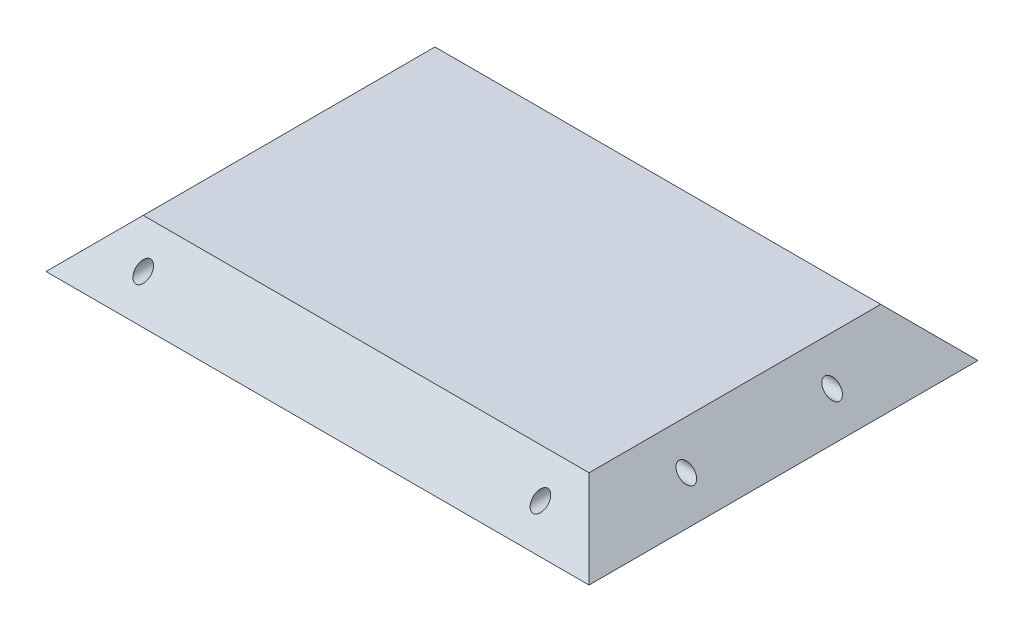
ISO-10303-21;
HEADER;
FILE_DESCRIPTION(('STEP AP214'),'2;1');
FILE_NAME('part.step','',(''),(''),'','','');
FILE_SCHEMA(('AUTOMOTIVE_DESIGN { 1 0 10303 214 1 1 1 1 }'));
ENDSEC;
DATA;
#1=APPLICATION_CONTEXT('core data for automotive mechanical design processes');
#2=APPLICATION_PROTOCOL_DEFINITION('international standard','automotive_design',2000,#1);
#3=PRODUCT_CONTEXT('',#1,'mechanical');
#4=PRODUCT('Part','Part','',(#3));
#5=PRODUCT_RELATED_PRODUCT_CATEGORY('part','',(#4));
#6=PRODUCT_DEFINITION_FORMATION('','',#4);
#7=PRODUCT_DEFINITION_CONTEXT('part definition',#1,'design');
#8=PRODUCT_DEFINITION('design','',#6,#7);
#9=PRODUCT_DEFINITION_SHAPE('','',#8);
#10=(LENGTH_UNIT() NAMED_UNIT(*) SI_UNIT(.MILLI.,.METRE.));
#11=(NAMED_UNIT(*) PLANE_ANGLE_UNIT() SI_UNIT($,.RADIAN.));
#12=(NAMED_UNIT(*) SI_UNIT($,.STERADIAN.) SOLID_ANGLE_UNIT());
#13=UNCERTAINTY_MEASURE_WITH_UNIT(LENGTH_MEASURE(1.E-05),#10,'distance_accuracy_value','');
#14=(GEOMETRIC_REPRESENTATION_CONTEXT(3) GLOBAL_UNCERTAINTY_ASSIGNED_CONTEXT((#13)) GLOBAL_UNIT_ASSIGNED_CONTEXT((#10,
#11,#12)) REPRESENTATION_CONTEXT('',''));
#15=CARTESIAN_POINT('',(0.,0.,0.));
#16=DIRECTION('',(0.,0.,1.));
#17=DIRECTION('',(1.,0.,0.));
#18=AXIS2_PLACEMENT_3D('',#15,#16,#17);
#19=CARTESIAN_POINT('',(-27.925,27.925,0.));
#20=DIRECTION('',(0.707106781186547,-0.707106781186547,0.));
#21=DIRECTION('',(0.707106781186548,0.707106781186547,0.));
#22=AXIS2_PLACEMENT_3D('',#19,#20,#21);
#23=PLANE('',#22);
#24=DIRECTION('',(0.577350269189626,0.577350269189626,-0.577350269189626));
#25=VECTOR('',#24,1.);
#26=CARTESIAN_POINT('',(-55.85,0.,40.));
#27=LINE('',#26,#25);
#28=CARTESIAN_POINT('',(-55.85,0.,40.));
#29=VERTEX_POINT('',#28);
#30=CARTESIAN_POINT('',(-45.85,10.,30.));
#31=VERTEX_POINT('',#30);
#32=EDGE_CURVE('E70',#29,#31,#27,.T.);
#33=ORIENTED_EDGE('',*,*,#32,.T.);
#34=DIRECTION('',(0.,0.,1.));
#35=VECTOR('',#34,1.);
#36=CARTESIAN_POINT('',(-45.85,10.,-30.));
#37=LINE('',#36,#35);
#38=CARTESIAN_POINT('',(-45.85,10.,-30.));
#39=VERTEX_POINT('',#38);
#40=EDGE_CURVE('E55',#39,#31,#37,.T.);
#41=ORIENTED_EDGE('',*,*,#40,.F.);
#42=DIRECTION('',(0.577350269189626,0.577350269189626,0.577350269189626));
#43=VECTOR('',#42,1.);
#44=CARTESIAN_POINT('',(-55.85,0.,-40.));
#45=LINE('',#44,#43);
#46=CARTESIAN_POINT('',(-55.85,0.,-40.));
#47=VERTEX_POINT('',#46);
#48=EDGE_CURVE('E110',#47,#39,#45,.T.);
#49=ORIENTED_EDGE('',*,*,#48,.F.);
#50=DIRECTION('',(0.,0.,1.));
#51=VECTOR('',#50,1.);
#52=CARTESIAN_POINT('',(-55.85,0.,40.));
#53=LINE('',#52,#51);
#54=EDGE_CURVE('E88',#47,#29,#53,.T.);
#55=ORIENTED_EDGE('',*,*,#54,.T.);
#56=EDGE_LOOP('',(#33,#41,#49,#55));
#57=FACE_BOUND('',#56,.T.);
#58=CARTESIAN_POINT('',(-50.85,5.,15.));
#59=DIRECTION('',(0.707106781186547,-0.707106781186547,0.));
#60=DIRECTION('',(-0.707106781186548,-0.707106781186547,0.));
#61=AXIS2_PLACEMENT_3D('',#58,#59,#60);
#62=ELLIPSE('',#61,2.12132034355964,1.5);
#63=CARTESIAN_POINT('',(-52.35,3.5,15.));
#64=VERTEX_POINT('',#63);
#65=EDGE_CURVE('E245',#64,#64,#62,.F.);
#66=ORIENTED_EDGE('',*,*,#65,.F.);
#67=EDGE_LOOP('',(#66));
#68=FACE_BOUND('',#67,.T.);
#69=CARTESIAN_POINT('',(-50.85,5.,-15.));
#70=DIRECTION('',(0.707106781186547,-0.707106781186547,0.));
#71=DIRECTION('',(-0.707106781186548,-0.707106781186547,0.));
#72=AXIS2_PLACEMENT_3D('',#69,#70,#71);
#73=ELLIPSE('',#72,2.12132034355964,1.5);
#74=CARTESIAN_POINT('',(-52.35,3.5,-15.));
#75=VERTEX_POINT('',#74);
#76=EDGE_CURVE('E50',#75,#75,#73,.T.);
#77=ORIENTED_EDGE('',*,*,#76,.T.);
#78=EDGE_LOOP('',(#77));
#79=FACE_BOUND('',#78,.T.);
#80=ADVANCED_FACE('F45',(#57,#68,#79),#23,.F.);
#81=CARTESIAN_POINT('',(27.925,27.925,0.));
#82=DIRECTION('',(-0.707106781186547,-0.707106781186547,0.));
#83=DIRECTION('',(0.707106781186548,-0.707106781186547,0.));
#84=AXIS2_PLACEMENT_3D('',#81,#82,#83);
#85=PLANE('',#84);
#86=CARTESIAN_POINT('',(50.85,5.,15.));
#87=DIRECTION('',(-0.707106781186547,-0.707106781186547,0.));
#88=DIRECTION('',(0.707106781186548,-0.707106781186547,0.));
#89=AXIS2_PLACEMENT_3D('',#86,#87,#88);
#90=ELLIPSE('',#89,2.12132034355964,1.5);
#91=CARTESIAN_POINT('',(52.35,3.5,15.));
#92=VERTEX_POINT('',#91);
#93=EDGE_CURVE('E238',#92,#92,#90,.T.);
#94=ORIENTED_EDGE('',*,*,#93,.T.);
#95=EDGE_LOOP('',(#94));
#96=FACE_BOUND('',#95,.T.);
#97=DIRECTION('',(-0.577350269189626,0.577350269189626,0.577350269189626));
#98=VECTOR('',#97,1.);
#99=CARTESIAN_POINT('',(55.85,0.,-40.));
#100=LINE('',#99,#98);
#101=CARTESIAN_POINT('',(55.85,0.,-40.));
#102=VERTEX_POINT('',#101);
#103=CARTESIAN_POINT('',(45.85,10.,-30.));
#104=VERTEX_POINT('',#103);
#105=EDGE_CURVE('E113',#102,#104,#100,.T.);
#106=ORIENTED_EDGE('',*,*,#105,.T.);
#107=DIRECTION('',(0.,0.,-1.));
#108=VECTOR('',#107,1.);
#109=CARTESIAN_POINT('',(45.85,10.,30.));
#110=LINE('',#109,#108);
#111=CARTESIAN_POINT('',(45.85,10.,30.));
#112=VERTEX_POINT('',#111);
#113=EDGE_CURVE('E211',#112,#104,#110,.T.);
#114=ORIENTED_EDGE('',*,*,#113,.F.);
#115=DIRECTION('',(-0.577350269189626,0.577350269189626,-0.577350269189626));
#116=VECTOR('',#115,1.);
#117=CARTESIAN_POINT('',(55.85,0.,40.));
#118=LINE('',#117,#116);
#119=CARTESIAN_POINT('',(55.85,0.,40.));
#120=VERTEX_POINT('',#119);
#121=EDGE_CURVE('E120',#120,#112,#118,.T.);
#122=ORIENTED_EDGE('',*,*,#121,.F.);
#123=DIRECTION('',(0.,0.,-1.));
#124=VECTOR('',#123,1.);
#125=CARTESIAN_POINT('',(55.85,0.,40.));
#126=LINE('',#125,#124);
#127=EDGE_CURVE('E114',#120,#102,#126,.T.);
#128=ORIENTED_EDGE('',*,*,#127,.T.);
#129=EDGE_LOOP('',(#106,#114,#122,#128));
#130=FACE_BOUND('',#129,.T.);
#131=CARTESIAN_POINT('',(50.85,5.,-15.));
#132=DIRECTION('',(-0.707106781186547,-0.707106781186547,0.));
#133=DIRECTION('',(0.707106781186548,-0.707106781186547,0.));
#134=AXIS2_PLACEMENT_3D('',#131,#132,#133);
#135=ELLIPSE('',#134,2.12132034355964,1.5);
#136=CARTESIAN_POINT('',(52.35,3.5,-15.));
#137=VERTEX_POINT('',#136);
#138=EDGE_CURVE('E241',#137,#137,#135,.F.);
#139=ORIENTED_EDGE('',*,*,#138,.F.);
#140=EDGE_LOOP('',(#139));
#141=FACE_BOUND('',#140,.T.);
#142=ADVANCED_FACE('F144',(#96,#130,#141),#85,.F.);
#143=CARTESIAN_POINT('',(0.,20.,-20.));
#144=DIRECTION('',(0.,-0.707106781186547,0.707106781186547));
#145=DIRECTION('',(0.,-0.707106781186547,-0.707106781186548));
#146=AXIS2_PLACEMENT_3D('',#143,#144,#145);
#147=PLANE('',#146);
#148=CARTESIAN_POINT('',(-40.85,4.99999999999999,-35.));
#149=DIRECTION('',(0.,-0.707106781186547,0.707106781186547));
#150=DIRECTION('',(0.,-0.707106781186547,-0.707106781186548));
#151=AXIS2_PLACEMENT_3D('',#148,#149,#150);
#152=ELLIPSE('',#151,2.12132034355965,1.5);
#153=CARTESIAN_POINT('',(-40.85,3.49999999999999,-36.5));
#154=VERTEX_POINT('',#153);
#155=EDGE_CURVE('E230',#154,#154,#152,.T.);
#156=ORIENTED_EDGE('',*,*,#155,.T.);
#157=EDGE_LOOP('',(#156));
#158=FACE_BOUND('',#157,.T.);
#159=ORIENTED_EDGE('',*,*,#48,.T.);
#160=DIRECTION('',(-1.,0.,0.));
#161=VECTOR('',#160,1.);
#162=CARTESIAN_POINT('',(45.85,10.,-30.));
#163=LINE('',#162,#161);
#164=EDGE_CURVE('E205',#104,#39,#163,.T.);
#165=ORIENTED_EDGE('',*,*,#164,.F.);
#166=ORIENTED_EDGE('',*,*,#105,.F.);
#167=DIRECTION('',(-1.,0.,0.));
#168=VECTOR('',#167,1.);
#169=CARTESIAN_POINT('',(-55.85,0.,-40.));
#170=LINE('',#169,#168);
#171=EDGE_CURVE('E93',#102,#47,#170,.T.);
#172=ORIENTED_EDGE('',*,*,#171,.T.);
#173=EDGE_LOOP('',(#159,#165,#166,#172));
#174=FACE_BOUND('',#173,.T.);
#175=CARTESIAN_POINT('',(40.85,5.,-35.));
#176=DIRECTION('',(0.,-0.707106781186547,0.707106781186547));
#177=DIRECTION('',(0.,-0.707106781186547,-0.707106781186548));
#178=AXIS2_PLACEMENT_3D('',#175,#176,#177);
#179=ELLIPSE('',#178,2.12132034355965,1.5);
#180=CARTESIAN_POINT('',(40.85,3.5,-36.5));
#181=VERTEX_POINT('',#180);
#182=EDGE_CURVE('E233',#181,#181,#179,.F.);
#183=ORIENTED_EDGE('',*,*,#182,.F.);
#184=EDGE_LOOP('',(#183));
#185=FACE_BOUND('',#184,.T.);
#186=ADVANCED_FACE('F108',(#158,#174,#185),#147,.F.);
#187=CARTESIAN_POINT('',(0.,20.,20.));
#188=DIRECTION('',(0.,-0.707106781186547,-0.707106781186547));
#189=DIRECTION('',(0.,0.707106781186547,-0.707106781186548));
#190=AXIS2_PLACEMENT_3D('',#187,#188,#189);
#191=PLANE('',#190);
#192=ORIENTED_EDGE('',*,*,#121,.T.);
#193=DIRECTION('',(1.,0.,0.));
#194=VECTOR('',#193,1.);
#195=CARTESIAN_POINT('',(-45.85,10.,30.));
#196=LINE('',#195,#194);
#197=EDGE_CURVE('E12',#31,#112,#196,.T.);
#198=ORIENTED_EDGE('',*,*,#197,.F.);
#199=ORIENTED_EDGE('',*,*,#32,.F.);
#200=DIRECTION('',(1.,0.,0.));
#201=VECTOR('',#200,1.);
#202=CARTESIAN_POINT('',(-55.85,0.,40.));
#203=LINE('',#202,#201);
#204=EDGE_CURVE('E97',#29,#120,#203,.T.);
#205=ORIENTED_EDGE('',*,*,#204,.T.);
#206=EDGE_LOOP('',(#192,#198,#199,#205));
#207=FACE_BOUND('',#206,.T.);
#208=CARTESIAN_POINT('',(-40.85,4.99999999999999,35.));
#209=DIRECTION('',(0.,-0.707106781186547,-0.707106781186547));
#210=DIRECTION('',(0.,-0.707106781186547,0.707106781186548));
#211=AXIS2_PLACEMENT_3D('',#208,#209,#210);
#212=ELLIPSE('',#211,2.12132034355965,1.5);
#213=CARTESIAN_POINT('',(-40.85,3.49999999999999,36.5));
#214=VERTEX_POINT('',#213);
#215=EDGE_CURVE('E218',#214,#214,#212,.F.);
#216=ORIENTED_EDGE('',*,*,#215,.F.);
#217=EDGE_LOOP('',(#216));
#218=FACE_BOUND('',#217,.T.);
#219=CARTESIAN_POINT('',(40.85,5.,35.));
#220=DIRECTION('',(0.,-0.707106781186547,-0.707106781186547));
#221=DIRECTION('',(0.,-0.707106781186547,0.707106781186548));
#222=AXIS2_PLACEMENT_3D('',#219,#220,#221);
#223=ELLIPSE('',#222,2.12132034355965,1.5);
#224=CARTESIAN_POINT('',(40.85,3.5,36.5));
#225=VERTEX_POINT('',#224);
#226=EDGE_CURVE('E226',#225,#225,#223,.T.);
#227=ORIENTED_EDGE('',*,*,#226,.T.);
#228=EDGE_LOOP('',(#227));
#229=FACE_BOUND('',#228,.T.);
#230=ADVANCED_FACE('F277',(#207,#218,#229),#191,.F.);
#231=CARTESIAN_POINT('',(0.,10.,0.));
#232=DIRECTION('',(0.,1.,0.));
#233=DIRECTION('',(0.,0.,1.));
#234=AXIS2_PLACEMENT_3D('',#231,#232,#233);
#235=PLANE('',#234);
#236=ORIENTED_EDGE('',*,*,#113,.T.);
#237=ORIENTED_EDGE('',*,*,#164,.T.);
#238=ORIENTED_EDGE('',*,*,#40,.T.);
#239=ORIENTED_EDGE('',*,*,#197,.T.);
#240=EDGE_LOOP('',(#236,#237,#238,#239));
#241=FACE_BOUND('',#240,.T.);
#242=ADVANCED_FACE('F47',(#241),#235,.T.);
#243=CARTESIAN_POINT('',(0.,0.,0.));
#244=DIRECTION('',(0.,-1.,0.));
#245=DIRECTION('',(0.,0.,-1.));
#246=AXIS2_PLACEMENT_3D('',#243,#244,#245);
#247=PLANE('',#246);
#248=ORIENTED_EDGE('',*,*,#127,.F.);
#249=ORIENTED_EDGE('',*,*,#204,.F.);
#250=ORIENTED_EDGE('',*,*,#54,.F.);
#251=ORIENTED_EDGE('',*,*,#171,.F.);
#252=EDGE_LOOP('',(#248,#249,#250,#251));
#253=FACE_BOUND('',#252,.T.);
#254=ADVANCED_FACE('F92',(#253),#247,.T.);
#255=CARTESIAN_POINT('',(-40.85,4.99999999999999,20.));
#256=DIRECTION('',(0.,0.,1.));
#257=DIRECTION('',(1.,0.,0.));
#258=AXIS2_PLACEMENT_3D('',#255,#256,#257);
#259=CYLINDRICAL_SURFACE('',#258,1.5);
#260=CARTESIAN_POINT('',(-40.85,4.99999999999999,20.));
#261=DIRECTION('',(0.,0.,-1.));
#262=DIRECTION('',(-1.,0.,0.));
#263=AXIS2_PLACEMENT_3D('',#260,#261,#262);
#264=CIRCLE('',#263,1.5);
#265=CARTESIAN_POINT('',(-42.35,4.99999999999999,20.));
#266=VERTEX_POINT('',#265);
#267=EDGE_CURVE('E237',#266,#266,#264,.T.);
#268=ORIENTED_EDGE('',*,*,#267,.T.);
#269=EDGE_LOOP('',(#268));
#270=FACE_BOUND('',#269,.T.);
#271=ORIENTED_EDGE('',*,*,#215,.T.);
#272=EDGE_LOOP('',(#271));
#273=FACE_BOUND('',#272,.T.);
#274=ADVANCED_FACE('F353',(#270,#273),#259,.F.);
#275=CARTESIAN_POINT('',(-40.85,4.99999999999999,20.));
#276=DIRECTION('',(0.,0.,-1.));
#277=DIRECTION('',(-1.,0.,0.));
#278=AXIS2_PLACEMENT_3D('',#275,#276,#277);
#279=PLANE('',#278);
#280=ORIENTED_EDGE('',*,*,#267,.F.);
#281=EDGE_LOOP('',(#280));
#282=FACE_BOUND('',#281,.T.);
#283=ADVANCED_FACE('F343',(#282),#279,.F.);
#284=CARTESIAN_POINT('',(40.85,5.,20.));
#285=DIRECTION('',(0.,0.,1.));
#286=DIRECTION('',(1.,0.,0.));
#287=AXIS2_PLACEMENT_3D('',#284,#285,#286);
#288=CYLINDRICAL_SURFACE('',#287,1.5);
#289=CARTESIAN_POINT('',(40.85,5.,20.));
#290=DIRECTION('',(0.,0.,1.));
#291=DIRECTION('',(1.,0.,0.));
#292=AXIS2_PLACEMENT_3D('',#289,#290,#291);
#293=CIRCLE('',#292,1.5);
#294=CARTESIAN_POINT('',(42.35,5.,20.));
#295=VERTEX_POINT('',#294);
#296=EDGE_CURVE('E227',#295,#295,#293,.T.);
#297=ORIENTED_EDGE('',*,*,#296,.F.);
#298=EDGE_LOOP('',(#297));
#299=FACE_BOUND('',#298,.T.);
#300=ORIENTED_EDGE('',*,*,#226,.F.);
#301=EDGE_LOOP('',(#300));
#302=FACE_BOUND('',#301,.T.);
#303=ADVANCED_FACE('F340',(#299,#302),#288,.F.);
#304=CARTESIAN_POINT('',(40.85,5.,20.));
#305=DIRECTION('',(0.,0.,1.));
#306=DIRECTION('',(1.,0.,0.));
#307=AXIS2_PLACEMENT_3D('',#304,#305,#306);
#308=PLANE('',#307);
#309=ORIENTED_EDGE('',*,*,#296,.T.);
#310=EDGE_LOOP('',(#309));
#311=FACE_BOUND('',#310,.T.);
#312=ADVANCED_FACE('F342',(#311),#308,.T.);
#313=CARTESIAN_POINT('',(-40.85,4.99999999999999,-20.));
#314=DIRECTION('',(0.,0.,-1.));
#315=DIRECTION('',(-1.,0.,0.));
#316=AXIS2_PLACEMENT_3D('',#313,#314,#315);
#317=CYLINDRICAL_SURFACE('',#316,1.5);
#318=CARTESIAN_POINT('',(-40.85,4.99999999999999,-20.));
#319=DIRECTION('',(0.,0.,-1.));
#320=DIRECTION('',(-1.,0.,0.));
#321=AXIS2_PLACEMENT_3D('',#318,#319,#320);
#322=CIRCLE('',#321,1.5);
#323=CARTESIAN_POINT('',(-42.35,4.99999999999999,-20.));
#324=VERTEX_POINT('',#323);
#325=EDGE_CURVE('E244',#324,#324,#322,.T.);
#326=ORIENTED_EDGE('',*,*,#325,.F.);
#327=EDGE_LOOP('',(#326));
#328=FACE_BOUND('',#327,.T.);
#329=ORIENTED_EDGE('',*,*,#155,.F.);
#330=EDGE_LOOP('',(#329));
#331=FACE_BOUND('',#330,.T.);
#332=ADVANCED_FACE('F350',(#328,#331),#317,.F.);
#333=CARTESIAN_POINT('',(-40.85,4.99999999999999,-20.));
#334=DIRECTION('',(0.,0.,1.));
#335=DIRECTION('',(-1.,0.,0.));
#336=AXIS2_PLACEMENT_3D('',#333,#334,#335);
#337=PLANE('',#336);
#338=ORIENTED_EDGE('',*,*,#325,.T.);
#339=EDGE_LOOP('',(#338));
#340=FACE_BOUND('',#339,.T.);
#341=ADVANCED_FACE('F465',(#340),#337,.F.);
#342=CARTESIAN_POINT('',(40.85,5.,-20.));
#343=DIRECTION('',(0.,0.,-1.));
#344=DIRECTION('',(-1.,0.,0.));
#345=AXIS2_PLACEMENT_3D('',#342,#343,#344);
#346=CYLINDRICAL_SURFACE('',#345,1.5);
#347=CARTESIAN_POINT('',(40.85,5.,-20.));
#348=DIRECTION('',(0.,0.,1.));
#349=DIRECTION('',(1.,0.,0.));
#350=AXIS2_PLACEMENT_3D('',#347,#348,#349);
#351=CIRCLE('',#350,1.5);
#352=CARTESIAN_POINT('',(42.35,5.,-20.));
#353=VERTEX_POINT('',#352);
#354=EDGE_CURVE('E234',#353,#353,#351,.T.);
#355=ORIENTED_EDGE('',*,*,#354,.T.);
#356=EDGE_LOOP('',(#355));
#357=FACE_BOUND('',#356,.T.);
#358=ORIENTED_EDGE('',*,*,#182,.T.);
#359=EDGE_LOOP('',(#358));
#360=FACE_BOUND('',#359,.T.);
#361=ADVANCED_FACE('F461',(#357,#360),#346,.F.);
#362=CARTESIAN_POINT('',(40.85,5.,-20.));
#363=DIRECTION('',(0.,0.,-1.));
#364=DIRECTION('',(1.,0.,0.));
#365=AXIS2_PLACEMENT_3D('',#362,#363,#364);
#366=PLANE('',#365);
#367=ORIENTED_EDGE('',*,*,#354,.F.);
#368=EDGE_LOOP('',(#367));
#369=FACE_BOUND('',#368,.T.);
#370=ADVANCED_FACE('F454',(#369),#366,.T.);
#371=CARTESIAN_POINT('',(35.85,5.,15.));
#372=DIRECTION('',(1.,0.,0.));
#373=DIRECTION('',(0.,0.,-1.));
#374=AXIS2_PLACEMENT_3D('',#371,#372,#373);
#375=CYLINDRICAL_SURFACE('',#374,1.5);
#376=CARTESIAN_POINT('',(35.85,5.,15.));
#377=DIRECTION('',(1.,0.,0.));
#378=DIRECTION('',(0.,0.,-1.));
#379=AXIS2_PLACEMENT_3D('',#376,#377,#378);
#380=CIRCLE('',#379,1.5);
#381=CARTESIAN_POINT('',(35.85,5.,13.5));
#382=VERTEX_POINT('',#381);
#383=EDGE_CURVE('E251',#382,#382,#380,.T.);
#384=ORIENTED_EDGE('',*,*,#383,.F.);
#385=EDGE_LOOP('',(#384));
#386=FACE_BOUND('',#385,.T.);
#387=ORIENTED_EDGE('',*,*,#93,.F.);
#388=EDGE_LOOP('',(#387));
#389=FACE_BOUND('',#388,.T.);
#390=ADVANCED_FACE('F451',(#386,#389),#375,.F.);
#391=CARTESIAN_POINT('',(35.85,5.,15.));
#392=DIRECTION('',(1.,0.,0.));
#393=DIRECTION('',(0.,0.,-1.));
#394=AXIS2_PLACEMENT_3D('',#391,#392,#393);
#395=PLANE('',#394);
#396=ORIENTED_EDGE('',*,*,#383,.T.);
#397=EDGE_LOOP('',(#396));
#398=FACE_BOUND('',#397,.T.);
#399=ADVANCED_FACE('F449',(#398),#395,.T.);
#400=CARTESIAN_POINT('',(35.85,5.,-15.));
#401=DIRECTION('',(1.,0.,0.));
#402=DIRECTION('',(0.,0.,-1.));
#403=AXIS2_PLACEMENT_3D('',#400,#401,#402);
#404=CYLINDRICAL_SURFACE('',#403,1.5);
#405=CARTESIAN_POINT('',(35.85,5.,-15.));
#406=DIRECTION('',(-1.,0.,0.));
#407=DIRECTION('',(0.,0.,1.));
#408=AXIS2_PLACEMENT_3D('',#405,#406,#407);
#409=CIRCLE('',#408,1.5);
#410=CARTESIAN_POINT('',(35.85,5.,-13.5));
#411=VERTEX_POINT('',#410);
#412=EDGE_CURVE('E242',#411,#411,#409,.T.);
#413=ORIENTED_EDGE('',*,*,#412,.T.);
#414=EDGE_LOOP('',(#413));
#415=FACE_BOUND('',#414,.T.);
#416=ORIENTED_EDGE('',*,*,#138,.T.);
#417=EDGE_LOOP('',(#416));
#418=FACE_BOUND('',#417,.T.);
#419=ADVANCED_FACE('F445',(#415,#418),#404,.F.);
#420=CARTESIAN_POINT('',(35.85,5.,-15.));
#421=DIRECTION('',(-1.,0.,0.));
#422=DIRECTION('',(0.,0.,1.));
#423=AXIS2_PLACEMENT_3D('',#420,#421,#422);
#424=PLANE('',#423);
#425=ORIENTED_EDGE('',*,*,#412,.F.);
#426=EDGE_LOOP('',(#425));
#427=FACE_BOUND('',#426,.T.);
#428=ADVANCED_FACE('F402',(#427),#424,.F.);
#429=CARTESIAN_POINT('',(-35.85,5.,15.));
#430=DIRECTION('',(-1.,0.,0.));
#431=DIRECTION('',(0.,0.,1.));
#432=AXIS2_PLACEMENT_3D('',#429,#430,#431);
#433=CYLINDRICAL_SURFACE('',#432,1.5);
#434=CARTESIAN_POINT('',(-35.85,5.,15.));
#435=DIRECTION('',(1.,0.,0.));
#436=DIRECTION('',(0.,0.,-1.));
#437=AXIS2_PLACEMENT_3D('',#434,#435,#436);
#438=CIRCLE('',#437,1.5);
#439=CARTESIAN_POINT('',(-35.85,5.,13.5));
#440=VERTEX_POINT('',#439);
#441=EDGE_CURVE('E253',#440,#440,#438,.T.);
#442=ORIENTED_EDGE('',*,*,#441,.T.);
#443=EDGE_LOOP('',(#442));
#444=FACE_BOUND('',#443,.T.);
#445=ORIENTED_EDGE('',*,*,#65,.T.);
#446=EDGE_LOOP('',(#445));
#447=FACE_BOUND('',#446,.T.);
#448=ADVANCED_FACE('F406',(#444,#447),#433,.F.);
#449=CARTESIAN_POINT('',(-35.85,5.,15.));
#450=DIRECTION('',(-1.,0.,0.));
#451=DIRECTION('',(0.,0.,-1.));
#452=AXIS2_PLACEMENT_3D('',#449,#450,#451);
#453=PLANE('',#452);
#454=ORIENTED_EDGE('',*,*,#441,.F.);
#455=EDGE_LOOP('',(#454));
#456=FACE_BOUND('',#455,.T.);
#457=ADVANCED_FACE('F410',(#456),#453,.T.);
#458=CARTESIAN_POINT('',(-35.85,5.,-15.));
#459=DIRECTION('',(-1.,0.,0.));
#460=DIRECTION('',(0.,0.,1.));
#461=AXIS2_PLACEMENT_3D('',#458,#459,#460);
#462=CYLINDRICAL_SURFACE('',#461,1.5);
#463=CARTESIAN_POINT('',(-35.85,5.,-15.));
#464=DIRECTION('',(-1.,0.,0.));
#465=DIRECTION('',(0.,0.,1.));
#466=AXIS2_PLACEMENT_3D('',#463,#464,#465);
#467=CIRCLE('',#466,1.5);
#468=CARTESIAN_POINT('',(-35.85,5.,-13.5));
#469=VERTEX_POINT('',#468);
#470=EDGE_CURVE('E247',#469,#469,#467,.T.);
#471=ORIENTED_EDGE('',*,*,#470,.F.);
#472=EDGE_LOOP('',(#471));
#473=FACE_BOUND('',#472,.T.);
#474=ORIENTED_EDGE('',*,*,#76,.F.);
#475=EDGE_LOOP('',(#474));
#476=FACE_BOUND('',#475,.T.);
#477=ADVANCED_FACE('F420',(#473,#476),#462,.F.);
#478=CARTESIAN_POINT('',(-35.85,5.,-15.));
#479=DIRECTION('',(1.,0.,0.));
#480=DIRECTION('',(0.,0.,1.));
#481=AXIS2_PLACEMENT_3D('',#478,#479,#480);
#482=PLANE('',#481);
#483=ORIENTED_EDGE('',*,*,#470,.T.);
#484=EDGE_LOOP('',(#483));
#485=FACE_BOUND('',#484,.T.);
#486=ADVANCED_FACE('F430',(#485),#482,.F.);
#487=CLOSED_SHELL('',(#80,#142,#186,#230,#242,#254,#274,#283,#303,#312,#332,#341,#361,#370,#390,
#399,#419,#428,#448,#457,#477,#486));
#488=MANIFOLD_SOLID_BREP('B2',#487);
#489=ADVANCED_BREP_SHAPE_REPRESENTATION('',(#18,#488),#14);
#490=SHAPE_DEFINITION_REPRESENTATION(#9,#489);
ENDSEC;
END-ISO-10303-21;
